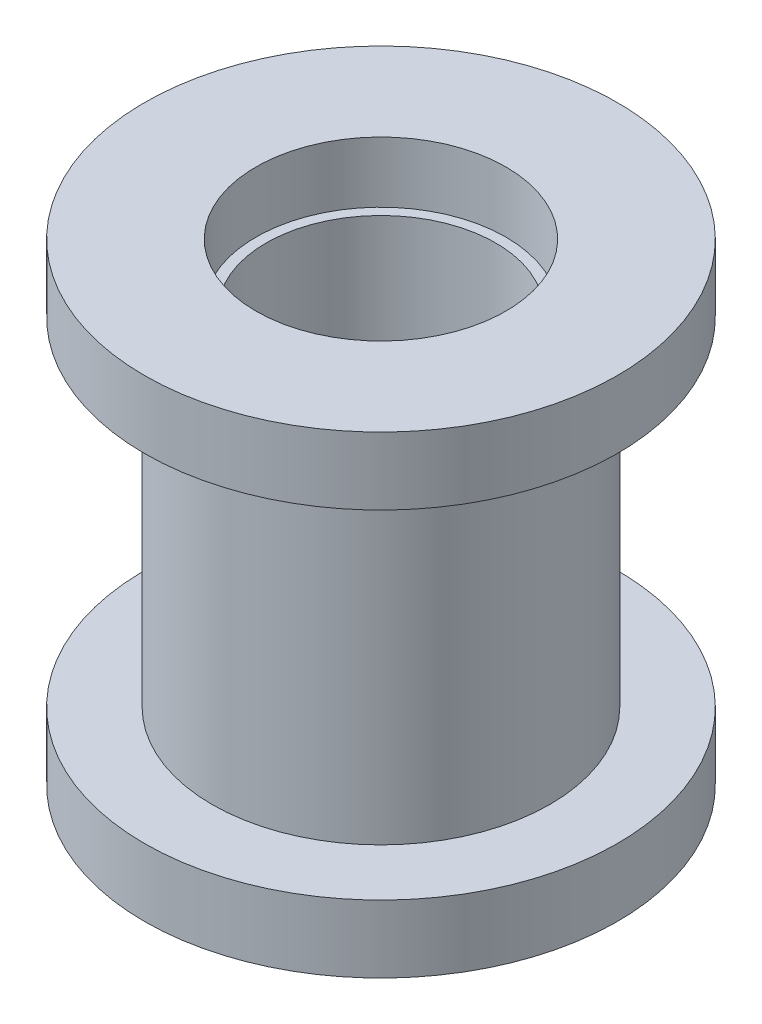
ISO-10303-21;
HEADER;
FILE_DESCRIPTION(('STEP AP214'),'2;1');
FILE_NAME('part.step','',(''),(''),'','','');
FILE_SCHEMA(('AUTOMOTIVE_DESIGN { 1 0 10303 214 1 1 1 1 }'));
ENDSEC;
DATA;
#1=APPLICATION_CONTEXT('core data for automotive mechanical design processes');
#2=APPLICATION_PROTOCOL_DEFINITION('international standard','automotive_design',2000,#1);
#3=PRODUCT_CONTEXT('',#1,'mechanical');
#4=PRODUCT('Part','Part','',(#3));
#5=PRODUCT_RELATED_PRODUCT_CATEGORY('part','',(#4));
#6=PRODUCT_DEFINITION_FORMATION('','',#4);
#7=PRODUCT_DEFINITION_CONTEXT('part definition',#1,'design');
#8=PRODUCT_DEFINITION('design','',#6,#7);
#9=PRODUCT_DEFINITION_SHAPE('','',#8);
#10=(LENGTH_UNIT() NAMED_UNIT(*) SI_UNIT(.MILLI.,.METRE.));
#11=(NAMED_UNIT(*) PLANE_ANGLE_UNIT() SI_UNIT($,.RADIAN.));
#12=(NAMED_UNIT(*) SI_UNIT($,.STERADIAN.) SOLID_ANGLE_UNIT());
#13=UNCERTAINTY_MEASURE_WITH_UNIT(LENGTH_MEASURE(1.E-05),#10,'distance_accuracy_value','');
#14=(GEOMETRIC_REPRESENTATION_CONTEXT(3) GLOBAL_UNCERTAINTY_ASSIGNED_CONTEXT((#13)) GLOBAL_UNIT_ASSIGNED_CONTEXT((#10,
#11,#12)) REPRESENTATION_CONTEXT('',''));
#15=CARTESIAN_POINT('',(0.,0.,0.));
#16=DIRECTION('',(0.,0.,1.));
#17=DIRECTION('',(1.,0.,0.));
#18=AXIS2_PLACEMENT_3D('',#15,#16,#17);
#19=CARTESIAN_POINT('',(0.,10.,0.));
#20=DIRECTION('',(0.,-1.,0.));
#21=DIRECTION('',(0.,0.,-1.));
#22=AXIS2_PLACEMENT_3D('',#19,#20,#21);
#23=CYLINDRICAL_SURFACE('',#22,35.);
#24=CARTESIAN_POINT('',(0.,10.,0.));
#25=DIRECTION('',(0.,1.,0.));
#26=DIRECTION('',(0.,0.,1.));
#27=AXIS2_PLACEMENT_3D('',#24,#25,#26);
#28=CIRCLE('',#27,35.);
#29=CARTESIAN_POINT('',(0.,10.,35.));
#30=VERTEX_POINT('',#29);
#31=EDGE_CURVE('E10',#30,#30,#28,.T.);
#32=ORIENTED_EDGE('',*,*,#31,.F.);
#33=EDGE_LOOP('',(#32));
#34=FACE_BOUND('',#33,.T.);
#35=CARTESIAN_POINT('',(0.,0.,0.));
#36=DIRECTION('',(0.,1.,0.));
#37=DIRECTION('',(0.,0.,1.));
#38=AXIS2_PLACEMENT_3D('',#35,#36,#37);
#39=CIRCLE('',#38,35.);
#40=CARTESIAN_POINT('',(0.,0.,35.));
#41=VERTEX_POINT('',#40);
#42=EDGE_CURVE('E36',#41,#41,#39,.T.);
#43=ORIENTED_EDGE('',*,*,#42,.T.);
#44=EDGE_LOOP('',(#43));
#45=FACE_BOUND('',#44,.T.);
#46=ADVANCED_FACE('F33',(#34,#45),#23,.T.);
#47=CARTESIAN_POINT('',(0.,10.,0.));
#48=DIRECTION('',(0.,1.,0.));
#49=DIRECTION('',(0.,0.,1.));
#50=AXIS2_PLACEMENT_3D('',#47,#48,#49);
#51=PLANE('',#50);
#52=CARTESIAN_POINT('',(0.,10.,0.));
#53=DIRECTION('',(0.,1.,0.));
#54=DIRECTION('',(0.,0.,1.));
#55=AXIS2_PLACEMENT_3D('',#52,#53,#54);
#56=CIRCLE('',#55,25.);
#57=CARTESIAN_POINT('',(0.,10.,25.));
#58=VERTEX_POINT('',#57);
#59=EDGE_CURVE('E45',#58,#58,#56,.T.);
#60=ORIENTED_EDGE('',*,*,#59,.F.);
#61=EDGE_LOOP('',(#60));
#62=FACE_BOUND('',#61,.T.);
#63=ORIENTED_EDGE('',*,*,#31,.T.);
#64=EDGE_LOOP('',(#63));
#65=FACE_BOUND('',#64,.T.);
#66=ADVANCED_FACE('F128',(#62,#65),#51,.T.);
#67=CARTESIAN_POINT('',(0.,0.,0.));
#68=DIRECTION('',(0.,1.,0.));
#69=DIRECTION('',(0.,0.,1.));
#70=AXIS2_PLACEMENT_3D('',#67,#68,#69);
#71=PLANE('',#70);
#72=CARTESIAN_POINT('',(0.,0.,0.));
#73=DIRECTION('',(0.,1.,0.));
#74=DIRECTION('',(0.,0.,1.));
#75=AXIS2_PLACEMENT_3D('',#72,#73,#74);
#76=CIRCLE('',#75,18.5);
#77=CARTESIAN_POINT('',(0.,0.,18.5));
#78=VERTEX_POINT('',#77);
#79=EDGE_CURVE('E68',#78,#78,#76,.T.);
#80=ORIENTED_EDGE('',*,*,#79,.T.);
#81=EDGE_LOOP('',(#80));
#82=FACE_BOUND('',#81,.T.);
#83=ORIENTED_EDGE('',*,*,#42,.F.);
#84=EDGE_LOOP('',(#83));
#85=FACE_BOUND('',#84,.T.);
#86=ADVANCED_FACE('F75',(#82,#85),#71,.F.);
#87=CARTESIAN_POINT('',(0.,60.,0.));
#88=DIRECTION('',(0.,-1.,0.));
#89=DIRECTION('',(0.,0.,-1.));
#90=AXIS2_PLACEMENT_3D('',#87,#88,#89);
#91=CYLINDRICAL_SURFACE('',#90,25.);
#92=CARTESIAN_POINT('',(0.,60.,0.));
#93=DIRECTION('',(0.,1.,0.));
#94=DIRECTION('',(0.,0.,1.));
#95=AXIS2_PLACEMENT_3D('',#92,#93,#94);
#96=CIRCLE('',#95,25.);
#97=CARTESIAN_POINT('',(0.,60.,25.));
#98=VERTEX_POINT('',#97);
#99=EDGE_CURVE('E43',#98,#98,#96,.T.);
#100=ORIENTED_EDGE('',*,*,#99,.F.);
#101=EDGE_LOOP('',(#100));
#102=FACE_BOUND('',#101,.T.);
#103=ORIENTED_EDGE('',*,*,#59,.T.);
#104=EDGE_LOOP('',(#103));
#105=FACE_BOUND('',#104,.T.);
#106=ADVANCED_FACE('F118',(#102,#105),#91,.T.);
#107=CARTESIAN_POINT('',(0.,70.,0.));
#108=DIRECTION('',(0.,-1.,0.));
#109=DIRECTION('',(0.,0.,-1.));
#110=AXIS2_PLACEMENT_3D('',#107,#108,#109);
#111=CYLINDRICAL_SURFACE('',#110,35.);
#112=CARTESIAN_POINT('',(0.,70.,0.));
#113=DIRECTION('',(0.,1.,0.));
#114=DIRECTION('',(0.,0.,1.));
#115=AXIS2_PLACEMENT_3D('',#112,#113,#114);
#116=CIRCLE('',#115,35.);
#117=CARTESIAN_POINT('',(0.,70.,35.));
#118=VERTEX_POINT('',#117);
#119=EDGE_CURVE('E48',#118,#118,#116,.T.);
#120=ORIENTED_EDGE('',*,*,#119,.F.);
#121=EDGE_LOOP('',(#120));
#122=FACE_BOUND('',#121,.T.);
#123=CARTESIAN_POINT('',(0.,60.,0.));
#124=DIRECTION('',(0.,1.,0.));
#125=DIRECTION('',(0.,0.,1.));
#126=AXIS2_PLACEMENT_3D('',#123,#124,#125);
#127=CIRCLE('',#126,35.);
#128=CARTESIAN_POINT('',(0.,60.,35.));
#129=VERTEX_POINT('',#128);
#130=EDGE_CURVE('E51',#129,#129,#127,.T.);
#131=ORIENTED_EDGE('',*,*,#130,.T.);
#132=EDGE_LOOP('',(#131));
#133=FACE_BOUND('',#132,.T.);
#134=ADVANCED_FACE('F112',(#122,#133),#111,.T.);
#135=CARTESIAN_POINT('',(0.,70.,0.));
#136=DIRECTION('',(0.,1.,0.));
#137=DIRECTION('',(0.,0.,1.));
#138=AXIS2_PLACEMENT_3D('',#135,#136,#137);
#139=PLANE('',#138);
#140=CARTESIAN_POINT('',(0.,70.,0.));
#141=DIRECTION('',(0.,1.,0.));
#142=DIRECTION('',(0.,0.,1.));
#143=AXIS2_PLACEMENT_3D('',#140,#141,#142);
#144=CIRCLE('',#143,18.5);
#145=CARTESIAN_POINT('',(0.,70.,18.5));
#146=VERTEX_POINT('',#145);
#147=EDGE_CURVE('E57',#146,#146,#144,.T.);
#148=ORIENTED_EDGE('',*,*,#147,.F.);
#149=EDGE_LOOP('',(#148));
#150=FACE_BOUND('',#149,.T.);
#151=ORIENTED_EDGE('',*,*,#119,.T.);
#152=EDGE_LOOP('',(#151));
#153=FACE_BOUND('',#152,.T.);
#154=ADVANCED_FACE('F109',(#150,#153),#139,.T.);
#155=CARTESIAN_POINT('',(0.,60.,0.));
#156=DIRECTION('',(0.,1.,0.));
#157=DIRECTION('',(0.,0.,1.));
#158=AXIS2_PLACEMENT_3D('',#155,#156,#157);
#159=PLANE('',#158);
#160=ORIENTED_EDGE('',*,*,#99,.T.);
#161=EDGE_LOOP('',(#160));
#162=FACE_BOUND('',#161,.T.);
#163=ORIENTED_EDGE('',*,*,#130,.F.);
#164=EDGE_LOOP('',(#163));
#165=FACE_BOUND('',#164,.T.);
#166=ADVANCED_FACE('F105',(#162,#165),#159,.F.);
#167=CARTESIAN_POINT('',(0.,61.,0.));
#168=DIRECTION('',(0.,1.,0.));
#169=DIRECTION('',(0.,0.,1.));
#170=AXIS2_PLACEMENT_3D('',#167,#168,#169);
#171=CYLINDRICAL_SURFACE('',#170,18.5);
#172=CARTESIAN_POINT('',(0.,61.,0.));
#173=DIRECTION('',(0.,1.,0.));
#174=DIRECTION('',(0.,0.,1.));
#175=AXIS2_PLACEMENT_3D('',#172,#173,#174);
#176=CIRCLE('',#175,18.5);
#177=CARTESIAN_POINT('',(0.,61.,18.5));
#178=VERTEX_POINT('',#177);
#179=EDGE_CURVE('E54',#178,#178,#176,.T.);
#180=ORIENTED_EDGE('',*,*,#179,.F.);
#181=EDGE_LOOP('',(#180));
#182=FACE_BOUND('',#181,.T.);
#183=ORIENTED_EDGE('',*,*,#147,.T.);
#184=EDGE_LOOP('',(#183));
#185=FACE_BOUND('',#184,.T.);
#186=ADVANCED_FACE('F99',(#182,#185),#171,.F.);
#187=CARTESIAN_POINT('',(0.,61.,0.));
#188=DIRECTION('',(0.,1.,0.));
#189=DIRECTION('',(0.,0.,1.));
#190=AXIS2_PLACEMENT_3D('',#187,#188,#189);
#191=PLANE('',#190);
#192=CARTESIAN_POINT('',(0.,61.,0.));
#193=DIRECTION('',(0.,1.,0.));
#194=DIRECTION('',(0.,0.,1.));
#195=AXIS2_PLACEMENT_3D('',#192,#193,#194);
#196=CIRCLE('',#195,17.);
#197=CARTESIAN_POINT('',(0.,61.,17.));
#198=VERTEX_POINT('',#197);
#199=EDGE_CURVE('E60',#198,#198,#196,.T.);
#200=ORIENTED_EDGE('',*,*,#199,.F.);
#201=EDGE_LOOP('',(#200));
#202=FACE_BOUND('',#201,.T.);
#203=ORIENTED_EDGE('',*,*,#179,.T.);
#204=EDGE_LOOP('',(#203));
#205=FACE_BOUND('',#204,.T.);
#206=ADVANCED_FACE('F93',(#202,#205),#191,.T.);
#207=CARTESIAN_POINT('',(0.,9.00000000000001,0.));
#208=DIRECTION('',(0.,1.,0.));
#209=DIRECTION('',(0.,0.,1.));
#210=AXIS2_PLACEMENT_3D('',#207,#208,#209);
#211=CYLINDRICAL_SURFACE('',#210,17.);
#212=CARTESIAN_POINT('',(0.,9.00000000000001,0.));
#213=DIRECTION('',(0.,1.,0.));
#214=DIRECTION('',(0.,0.,1.));
#215=AXIS2_PLACEMENT_3D('',#212,#213,#214);
#216=CIRCLE('',#215,17.);
#217=CARTESIAN_POINT('',(0.,9.00000000000001,17.));
#218=VERTEX_POINT('',#217);
#219=EDGE_CURVE('E65',#218,#218,#216,.F.);
#220=CARTESIAN_POINT('',(0.,9.00000000000001,17.));
#221=CARTESIAN_POINT('',(0.,9.54166666666667,17.));
#222=CARTESIAN_POINT('',(0.,10.0833333333333,17.));
#223=CARTESIAN_POINT('',(0.,11.1666666666667,17.));
#224=CARTESIAN_POINT('',(0.,11.7083333333333,17.));
#225=CARTESIAN_POINT('',(0.,12.7916666666667,17.));
#226=CARTESIAN_POINT('',(0.,13.3333333333333,17.));
#227=CARTESIAN_POINT('',(0.,14.4166666666667,17.));
#228=CARTESIAN_POINT('',(0.,14.9583333333333,17.));
#229=CARTESIAN_POINT('',(0.,16.0416666666667,17.));
#230=CARTESIAN_POINT('',(0.,16.5833333333333,17.));
#231=CARTESIAN_POINT('',(0.,17.6666666666667,17.));
#232=CARTESIAN_POINT('',(0.,18.2083333333333,17.));
#233=CARTESIAN_POINT('',(0.,19.2916666666667,17.));
#234=CARTESIAN_POINT('',(0.,19.8333333333333,17.));
#235=CARTESIAN_POINT('',(0.,20.9166666666667,17.));
#236=CARTESIAN_POINT('',(0.,21.4583333333333,17.));
#237=CARTESIAN_POINT('',(0.,22.5416666666667,17.));
#238=CARTESIAN_POINT('',(0.,23.0833333333333,17.));
#239=CARTESIAN_POINT('',(0.,24.1666666666667,17.));
#240=CARTESIAN_POINT('',(0.,24.7083333333333,17.));
#241=CARTESIAN_POINT('',(0.,25.7916666666667,17.));
#242=CARTESIAN_POINT('',(0.,26.3333333333333,17.));
#243=CARTESIAN_POINT('',(0.,27.4166666666667,17.));
#244=CARTESIAN_POINT('',(0.,27.9583333333333,17.));
#245=CARTESIAN_POINT('',(0.,29.0416666666667,17.));
#246=CARTESIAN_POINT('',(0.,29.5833333333333,17.));
#247=CARTESIAN_POINT('',(0.,30.6666666666667,17.));
#248=CARTESIAN_POINT('',(0.,31.2083333333333,17.));
#249=CARTESIAN_POINT('',(0.,32.2916666666667,17.));
#250=CARTESIAN_POINT('',(0.,32.8333333333333,17.));
#251=CARTESIAN_POINT('',(0.,33.9166666666667,17.));
#252=CARTESIAN_POINT('',(0.,34.4583333333333,17.));
#253=CARTESIAN_POINT('',(0.,35.5416666666667,17.));
#254=CARTESIAN_POINT('',(0.,36.0833333333333,17.));
#255=CARTESIAN_POINT('',(0.,37.1666666666667,17.));
#256=CARTESIAN_POINT('',(0.,37.7083333333333,17.));
#257=CARTESIAN_POINT('',(0.,38.7916666666667,17.));
#258=CARTESIAN_POINT('',(0.,39.3333333333333,17.));
#259=CARTESIAN_POINT('',(0.,40.4166666666667,17.));
#260=CARTESIAN_POINT('',(0.,40.9583333333333,17.));
#261=CARTESIAN_POINT('',(0.,42.0416666666667,17.));
#262=CARTESIAN_POINT('',(0.,42.5833333333333,17.));
#263=CARTESIAN_POINT('',(0.,43.6666666666667,17.));
#264=CARTESIAN_POINT('',(0.,44.2083333333333,17.));
#265=CARTESIAN_POINT('',(0.,45.2916666666667,17.));
#266=CARTESIAN_POINT('',(0.,45.8333333333333,17.));
#267=CARTESIAN_POINT('',(0.,46.9166666666667,17.));
#268=CARTESIAN_POINT('',(0.,47.4583333333333,17.));
#269=CARTESIAN_POINT('',(0.,48.5416666666667,17.));
#270=CARTESIAN_POINT('',(0.,49.0833333333333,17.));
#271=CARTESIAN_POINT('',(0.,50.1666666666667,17.));
#272=CARTESIAN_POINT('',(0.,50.7083333333333,17.));
#273=CARTESIAN_POINT('',(0.,51.7916666666667,17.));
#274=CARTESIAN_POINT('',(0.,52.3333333333333,17.));
#275=CARTESIAN_POINT('',(0.,53.4166666666667,17.));
#276=CARTESIAN_POINT('',(0.,53.9583333333333,17.));
#277=CARTESIAN_POINT('',(0.,55.0416666666667,17.));
#278=CARTESIAN_POINT('',(0.,55.5833333333333,17.));
#279=CARTESIAN_POINT('',(0.,56.6666666666667,17.));
#280=CARTESIAN_POINT('',(0.,57.2083333333333,17.));
#281=CARTESIAN_POINT('',(0.,58.2916666666667,17.));
#282=CARTESIAN_POINT('',(0.,58.8333333333333,17.));
#283=CARTESIAN_POINT('',(0.,59.9166666666667,17.));
#284=CARTESIAN_POINT('',(0.,60.4583333333333,17.));
#285=CARTESIAN_POINT('',(0.,61.,17.));
#286=B_SPLINE_CURVE_WITH_KNOTS('',3,(#220,#221,#222,#223,#224,#225,#226,#227,#228,#229,#230,
#231,#232,#233,#234,#235,#236,#237,#238,#239,#240,#241,#242,#243,#244,#245,#246,#247,#248,#249,
#250,#251,#252,#253,#254,#255,#256,#257,#258,#259,#260,#261,#262,#263,#264,#265,#266,#267,#268,
#269,#270,#271,#272,#273,#274,#275,#276,#277,#278,#279,#280,#281,#282,#283,#284,#285),
.UNSPECIFIED.,.F.,.F.,(4,2,2,2,2,2,2,2,2,2,2,2,2,2,2,2,2,2,2,2,2,2,2,2,2,2,2,2,2,2,2,2,4),(0.,
1.625,3.25,4.875,6.5,8.125,9.75,11.375,13.,14.625,16.25,17.875,19.5,21.125,22.75,24.375,26.,
27.625,29.25,30.875,32.5,34.125,35.75,37.375,39.,40.625,42.25,43.875,45.5,47.125,48.75,50.375,
52.),.UNSPECIFIED.);
#287=EDGE_CURVE('BSEAM87',#218,#198,#286,.T.);
#288=ORIENTED_EDGE('',*,*,#219,.T.);
#289=ORIENTED_EDGE('',*,*,#199,.T.);
#290=ORIENTED_EDGE('',*,*,#287,.T.);
#291=ORIENTED_EDGE('',*,*,#287,.F.);
#292=EDGE_LOOP('',(#288,#290,#289,#291));
#293=FACE_BOUND('',#292,.T.);
#294=ADVANCED_FACE('F87',(#293),#211,.F.);
#295=CARTESIAN_POINT('',(0.,9.00000000000001,0.));
#296=DIRECTION('',(0.,1.,0.));
#297=DIRECTION('',(0.,0.,1.));
#298=AXIS2_PLACEMENT_3D('',#295,#296,#297);
#299=PLANE('',#298);
#300=CARTESIAN_POINT('',(0.,9.00000000000001,0.));
#301=DIRECTION('',(0.,1.,0.));
#302=DIRECTION('',(0.,0.,1.));
#303=AXIS2_PLACEMENT_3D('',#300,#301,#302);
#304=CIRCLE('',#303,18.5);
#305=CARTESIAN_POINT('',(0.,9.00000000000001,18.5));
#306=VERTEX_POINT('',#305);
#307=EDGE_CURVE('E69',#306,#306,#304,.T.);
#308=ORIENTED_EDGE('',*,*,#307,.F.);
#309=EDGE_LOOP('',(#308));
#310=FACE_BOUND('',#309,.T.);
#311=ORIENTED_EDGE('',*,*,#219,.F.);
#312=EDGE_LOOP('',(#311));
#313=FACE_BOUND('',#312,.T.);
#314=ADVANCED_FACE('F81',(#310,#313),#299,.F.);
#315=CARTESIAN_POINT('',(0.,0.,0.));
#316=DIRECTION('',(0.,1.,0.));
#317=DIRECTION('',(0.,0.,1.));
#318=AXIS2_PLACEMENT_3D('',#315,#316,#317);
#319=CYLINDRICAL_SURFACE('',#318,18.5);
#320=ORIENTED_EDGE('',*,*,#79,.F.);
#321=EDGE_LOOP('',(#320));
#322=FACE_BOUND('',#321,.T.);
#323=ORIENTED_EDGE('',*,*,#307,.T.);
#324=EDGE_LOOP('',(#323));
#325=FACE_BOUND('',#324,.T.);
#326=ADVANCED_FACE('F78',(#322,#325),#319,.F.);
#327=CLOSED_SHELL('',(#46,#66,#86,#106,#134,#154,#166,#186,#206,#294,#314,#326));
#328=MANIFOLD_SOLID_BREP('B2',#327);
#329=ADVANCED_BREP_SHAPE_REPRESENTATION('',(#18,#328),#14);
#330=SHAPE_DEFINITION_REPRESENTATION(#9,#329);
ENDSEC;
END-ISO-10303-21;
